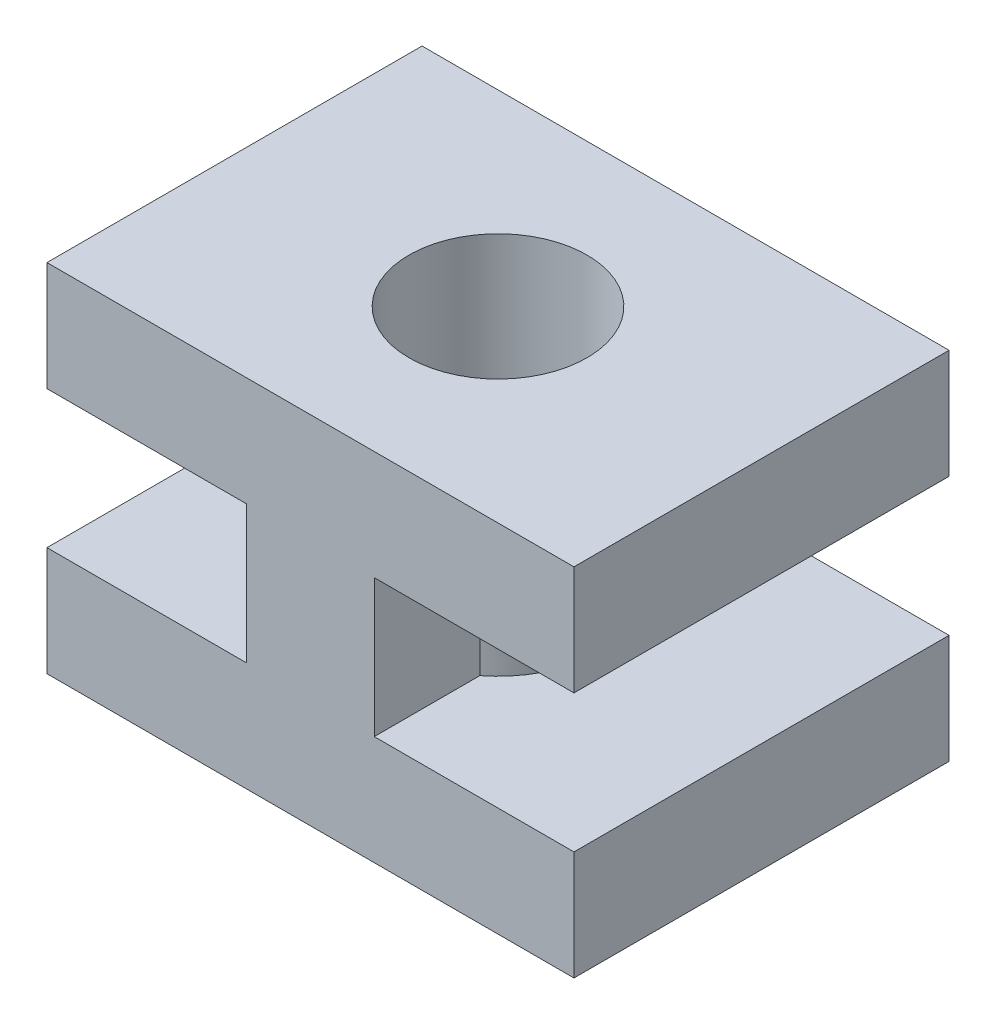
ISO-10303-21;
HEADER;
FILE_DESCRIPTION(('STEP AP214'),'2;1');
FILE_NAME('part.step','',(''),(''),'','','');
FILE_SCHEMA(('AUTOMOTIVE_DESIGN { 1 0 10303 214 1 1 1 1 }'));
ENDSEC;
DATA;
#1=APPLICATION_CONTEXT('core data for automotive mechanical design processes');
#2=APPLICATION_PROTOCOL_DEFINITION('international standard','automotive_design',2000,#1);
#3=PRODUCT_CONTEXT('',#1,'mechanical');
#4=PRODUCT('Part','Part','',(#3));
#5=PRODUCT_RELATED_PRODUCT_CATEGORY('part','',(#4));
#6=PRODUCT_DEFINITION_FORMATION('','',#4);
#7=PRODUCT_DEFINITION_CONTEXT('part definition',#1,'design');
#8=PRODUCT_DEFINITION('design','',#6,#7);
#9=PRODUCT_DEFINITION_SHAPE('','',#8);
#10=(LENGTH_UNIT() NAMED_UNIT(*) SI_UNIT(.MILLI.,.METRE.));
#11=(NAMED_UNIT(*) PLANE_ANGLE_UNIT() SI_UNIT($,.RADIAN.));
#12=(NAMED_UNIT(*) SI_UNIT($,.STERADIAN.) SOLID_ANGLE_UNIT());
#13=UNCERTAINTY_MEASURE_WITH_UNIT(LENGTH_MEASURE(1.E-05),#10,'distance_accuracy_value','');
#14=(GEOMETRIC_REPRESENTATION_CONTEXT(3) GLOBAL_UNCERTAINTY_ASSIGNED_CONTEXT((#13)) GLOBAL_UNIT_ASSIGNED_CONTEXT((#10,
#11,#12)) REPRESENTATION_CONTEXT('',''));
#15=CARTESIAN_POINT('',(0.,0.,0.));
#16=DIRECTION('',(0.,0.,1.));
#17=DIRECTION('',(1.,0.,0.));
#18=AXIS2_PLACEMENT_3D('',#15,#16,#17);
#19=CARTESIAN_POINT('',(1.075,1.16,0.));
#20=DIRECTION('',(-1.,0.,0.));
#21=DIRECTION('',(0.,0.,1.));
#22=AXIS2_PLACEMENT_3D('',#19,#20,#21);
#23=PLANE('',#22);
#24=DIRECTION('',(0.,-1.,0.));
#25=VECTOR('',#24,1.);
#26=CARTESIAN_POINT('',(1.075,1.16,3.16));
#27=LINE('',#26,#25);
#28=CARTESIAN_POINT('',(1.075,1.16,3.16));
#29=VERTEX_POINT('',#28);
#30=CARTESIAN_POINT('',(1.075,-1.16,3.16));
#31=VERTEX_POINT('',#30);
#32=EDGE_CURVE('E48',#29,#31,#27,.T.);
#33=ORIENTED_EDGE('',*,*,#32,.T.);
#34=DIRECTION('',(0.,0.,-1.));
#35=VECTOR('',#34,1.);
#36=CARTESIAN_POINT('',(1.075,-1.16,0.));
#37=LINE('',#36,#35);
#38=CARTESIAN_POINT('',(1.075,-1.16,1.38089644796415));
#39=VERTEX_POINT('',#38);
#40=EDGE_CURVE('E134',#31,#39,#37,.T.);
#41=ORIENTED_EDGE('',*,*,#40,.T.);
#42=DIRECTION('',(0.,-1.,0.));
#43=VECTOR('',#42,1.);
#44=CARTESIAN_POINT('',(1.075,1.16,1.38089644796415));
#45=LINE('',#44,#43);
#46=CARTESIAN_POINT('',(1.075,1.16,1.38089644796415));
#47=VERTEX_POINT('',#46);
#48=EDGE_CURVE('E11',#47,#39,#45,.T.);
#49=ORIENTED_EDGE('',*,*,#48,.F.);
#50=DIRECTION('',(0.,0.,-1.));
#51=VECTOR('',#50,1.);
#52=CARTESIAN_POINT('',(1.075,1.16,0.));
#53=LINE('',#52,#51);
#54=EDGE_CURVE('E211',#29,#47,#53,.T.);
#55=ORIENTED_EDGE('',*,*,#54,.F.);
#56=EDGE_LOOP('',(#33,#41,#49,#55));
#57=FACE_BOUND('',#56,.T.);
#58=ADVANCED_FACE('F34',(#57),#23,.F.);
#59=CARTESIAN_POINT('',(0.,1.16,0.));
#60=DIRECTION('',(0.,-1.,0.));
#61=DIRECTION('',(0.,0.,-1.));
#62=AXIS2_PLACEMENT_3D('',#59,#60,#61);
#63=CYLINDRICAL_SURFACE('',#62,1.75);
#64=ORIENTED_EDGE('',*,*,#48,.T.);
#65=CARTESIAN_POINT('',(0.,-1.16,0.));
#66=DIRECTION('',(0.,1.,0.));
#67=DIRECTION('',(0.,0.,1.));
#68=AXIS2_PLACEMENT_3D('',#65,#66,#67);
#69=CIRCLE('',#68,1.75);
#70=CARTESIAN_POINT('',(-1.075,-1.16,1.38089644796415));
#71=VERTEX_POINT('',#70);
#72=EDGE_CURVE('E174',#39,#71,#69,.T.);
#73=ORIENTED_EDGE('',*,*,#72,.T.);
#74=DIRECTION('',(0.,-1.,0.));
#75=VECTOR('',#74,1.);
#76=CARTESIAN_POINT('',(-1.075,1.16,1.38089644796415));
#77=LINE('',#76,#75);
#78=CARTESIAN_POINT('',(-1.075,1.16,1.38089644796415));
#79=VERTEX_POINT('',#78);
#80=EDGE_CURVE('E41',#79,#71,#77,.T.);
#81=ORIENTED_EDGE('',*,*,#80,.F.);
#82=CARTESIAN_POINT('',(0.,1.16,0.));
#83=DIRECTION('',(0.,1.,0.));
#84=DIRECTION('',(0.,0.,1.));
#85=AXIS2_PLACEMENT_3D('',#82,#83,#84);
#86=CIRCLE('',#85,1.75);
#87=EDGE_CURVE('E214',#47,#79,#86,.T.);
#88=ORIENTED_EDGE('',*,*,#87,.F.);
#89=EDGE_LOOP('',(#64,#73,#81,#88));
#90=FACE_BOUND('',#89,.T.);
#91=ADVANCED_FACE('F225',(#90),#63,.T.);
#92=CARTESIAN_POINT('',(-1.075,1.16,0.));
#93=DIRECTION('',(1.,0.,0.));
#94=DIRECTION('',(0.,0.,-1.));
#95=AXIS2_PLACEMENT_3D('',#92,#93,#94);
#96=PLANE('',#95);
#97=ORIENTED_EDGE('',*,*,#80,.T.);
#98=DIRECTION('',(0.,0.,1.));
#99=VECTOR('',#98,1.);
#100=CARTESIAN_POINT('',(-1.075,-1.16,0.));
#101=LINE('',#100,#99);
#102=CARTESIAN_POINT('',(-1.075,-1.16,3.16));
#103=VERTEX_POINT('',#102);
#104=EDGE_CURVE('E171',#71,#103,#101,.T.);
#105=ORIENTED_EDGE('',*,*,#104,.T.);
#106=DIRECTION('',(0.,-1.,0.));
#107=VECTOR('',#106,1.);
#108=CARTESIAN_POINT('',(-1.075,1.16,3.16));
#109=LINE('',#108,#107);
#110=CARTESIAN_POINT('',(-1.075,1.16,3.16));
#111=VERTEX_POINT('',#110);
#112=EDGE_CURVE('E221',#111,#103,#109,.T.);
#113=ORIENTED_EDGE('',*,*,#112,.F.);
#114=DIRECTION('',(0.,0.,1.));
#115=VECTOR('',#114,1.);
#116=CARTESIAN_POINT('',(-1.075,1.16,0.));
#117=LINE('',#116,#115);
#118=EDGE_CURVE('E217',#79,#111,#117,.T.);
#119=ORIENTED_EDGE('',*,*,#118,.F.);
#120=EDGE_LOOP('',(#97,#105,#113,#119));
#121=FACE_BOUND('',#120,.T.);
#122=ADVANCED_FACE('F224',(#121),#96,.F.);
#123=CARTESIAN_POINT('',(0.,1.16,3.16));
#124=DIRECTION('',(0.,0.,-1.));
#125=DIRECTION('',(-1.,0.,0.));
#126=AXIS2_PLACEMENT_3D('',#123,#124,#125);
#127=PLANE('',#126);
#128=ORIENTED_EDGE('',*,*,#112,.T.);
#129=DIRECTION('',(1.,0.,0.));
#130=VECTOR('',#129,1.);
#131=CARTESIAN_POINT('',(-4.44,-1.16,3.16));
#132=LINE('',#131,#130);
#133=CARTESIAN_POINT('',(-4.44,-1.16,3.16));
#134=VERTEX_POINT('',#133);
#135=EDGE_CURVE('E145',#134,#103,#132,.T.);
#136=ORIENTED_EDGE('',*,*,#135,.F.);
#137=DIRECTION('',(0.,1.,0.));
#138=VECTOR('',#137,1.);
#139=CARTESIAN_POINT('',(-4.44,-3.,3.16));
#140=LINE('',#139,#138);
#141=CARTESIAN_POINT('',(-4.44,-3.,3.16));
#142=VERTEX_POINT('',#141);
#143=EDGE_CURVE('E154',#142,#134,#140,.T.);
#144=ORIENTED_EDGE('',*,*,#143,.F.);
#145=DIRECTION('',(1.,0.,0.));
#146=VECTOR('',#145,1.);
#147=CARTESIAN_POINT('',(-4.44,-3.,3.16));
#148=LINE('',#147,#146);
#149=CARTESIAN_POINT('',(4.44,-3.,3.16));
#150=VERTEX_POINT('',#149);
#151=EDGE_CURVE('E144',#142,#150,#148,.T.);
#152=ORIENTED_EDGE('',*,*,#151,.T.);
#153=DIRECTION('',(0.,1.,0.));
#154=VECTOR('',#153,1.);
#155=CARTESIAN_POINT('',(4.44,-3.,3.16));
#156=LINE('',#155,#154);
#157=CARTESIAN_POINT('',(4.44,-1.16,3.16));
#158=VERTEX_POINT('',#157);
#159=EDGE_CURVE('E165',#150,#158,#156,.T.);
#160=ORIENTED_EDGE('',*,*,#159,.T.);
#161=EDGE_CURVE('E162',#31,#158,#132,.T.);
#162=ORIENTED_EDGE('',*,*,#161,.F.);
#163=ORIENTED_EDGE('',*,*,#32,.F.);
#164=DIRECTION('',(1.,0.,0.));
#165=VECTOR('',#164,1.);
#166=CARTESIAN_POINT('',(-4.44,1.16,3.16));
#167=LINE('',#166,#165);
#168=CARTESIAN_POINT('',(4.44,1.16,3.16));
#169=VERTEX_POINT('',#168);
#170=EDGE_CURVE('E193',#29,#169,#167,.T.);
#171=ORIENTED_EDGE('',*,*,#170,.T.);
#172=DIRECTION('',(0.,-1.,0.));
#173=VECTOR('',#172,1.);
#174=CARTESIAN_POINT('',(4.44,3.,3.16));
#175=LINE('',#174,#173);
#176=CARTESIAN_POINT('',(4.44,3.,3.16));
#177=VERTEX_POINT('',#176);
#178=EDGE_CURVE('E205',#177,#169,#175,.T.);
#179=ORIENTED_EDGE('',*,*,#178,.F.);
#180=DIRECTION('',(1.,0.,0.));
#181=VECTOR('',#180,1.);
#182=CARTESIAN_POINT('',(-4.44,3.,3.16));
#183=LINE('',#182,#181);
#184=CARTESIAN_POINT('',(-4.44,3.,3.16));
#185=VERTEX_POINT('',#184);
#186=EDGE_CURVE('E183',#185,#177,#183,.T.);
#187=ORIENTED_EDGE('',*,*,#186,.F.);
#188=DIRECTION('',(0.,-1.,0.));
#189=VECTOR('',#188,1.);
#190=CARTESIAN_POINT('',(-4.44,3.,3.16));
#191=LINE('',#190,#189);
#192=CARTESIAN_POINT('',(-4.44,1.16,3.16));
#193=VERTEX_POINT('',#192);
#194=EDGE_CURVE('E208',#185,#193,#191,.T.);
#195=ORIENTED_EDGE('',*,*,#194,.T.);
#196=EDGE_CURVE('E194',#193,#111,#167,.T.);
#197=ORIENTED_EDGE('',*,*,#196,.T.);
#198=EDGE_LOOP('',(#128,#136,#144,#152,#160,#162,#163,#171,#179,#187,#195,#197));
#199=FACE_BOUND('',#198,.T.);
#200=ADVANCED_FACE('F230',(#199),#127,.F.);
#201=CARTESIAN_POINT('',(0.,1.16,0.));
#202=DIRECTION('',(0.,-1.,0.));
#203=DIRECTION('',(0.,0.,-1.));
#204=AXIS2_PLACEMENT_3D('',#201,#202,#203);
#205=CYLINDRICAL_SURFACE('',#204,1.5);
#206=CARTESIAN_POINT('',(0.,3.,0.));
#207=DIRECTION('',(0.,1.,0.));
#208=DIRECTION('',(0.,0.,1.));
#209=AXIS2_PLACEMENT_3D('',#206,#207,#208);
#210=CIRCLE('',#209,1.5);
#211=CARTESIAN_POINT('',(0.,3.,1.5));
#212=VERTEX_POINT('',#211);
#213=EDGE_CURVE('E176',#212,#212,#210,.T.);
#214=ORIENTED_EDGE('',*,*,#213,.T.);
#215=EDGE_LOOP('',(#214));
#216=FACE_BOUND('',#215,.T.);
#217=CARTESIAN_POINT('',(0.,-3.,0.));
#218=DIRECTION('',(0.,1.,0.));
#219=DIRECTION('',(0.,0.,1.));
#220=AXIS2_PLACEMENT_3D('',#217,#218,#219);
#221=CIRCLE('',#220,1.5);
#222=CARTESIAN_POINT('',(0.,-3.,1.5));
#223=VERTEX_POINT('',#222);
#224=EDGE_CURVE('E157',#223,#223,#221,.T.);
#225=ORIENTED_EDGE('',*,*,#224,.F.);
#226=EDGE_LOOP('',(#225));
#227=FACE_BOUND('',#226,.T.);
#228=ADVANCED_FACE('F274',(#216,#227),#205,.F.);
#229=CARTESIAN_POINT('',(0.,1.16,0.));
#230=DIRECTION('',(0.,1.,0.));
#231=DIRECTION('',(0.,0.,1.));
#232=AXIS2_PLACEMENT_3D('',#229,#230,#231);
#233=PLANE('',#232);
#234=ORIENTED_EDGE('',*,*,#170,.F.);
#235=ORIENTED_EDGE('',*,*,#54,.T.);
#236=ORIENTED_EDGE('',*,*,#87,.T.);
#237=ORIENTED_EDGE('',*,*,#118,.T.);
#238=ORIENTED_EDGE('',*,*,#196,.F.);
#239=DIRECTION('',(0.,0.,1.));
#240=VECTOR('',#239,1.);
#241=CARTESIAN_POINT('',(-4.44,1.16,-3.16));
#242=LINE('',#241,#240);
#243=CARTESIAN_POINT('',(-4.44,1.16,-3.16));
#244=VERTEX_POINT('',#243);
#245=EDGE_CURVE('E179',#244,#193,#242,.T.);
#246=ORIENTED_EDGE('',*,*,#245,.F.);
#247=DIRECTION('',(-1.,0.,0.));
#248=VECTOR('',#247,1.);
#249=CARTESIAN_POINT('',(-4.44,1.16,-3.16));
#250=LINE('',#249,#248);
#251=CARTESIAN_POINT('',(4.44,1.16,-3.16));
#252=VERTEX_POINT('',#251);
#253=EDGE_CURVE('E184',#252,#244,#250,.T.);
#254=ORIENTED_EDGE('',*,*,#253,.F.);
#255=DIRECTION('',(0.,0.,-1.));
#256=VECTOR('',#255,1.);
#257=CARTESIAN_POINT('',(4.44,1.16,-3.16));
#258=LINE('',#257,#256);
#259=EDGE_CURVE('E197',#169,#252,#258,.T.);
#260=ORIENTED_EDGE('',*,*,#259,.F.);
#261=EDGE_LOOP('',(#234,#235,#236,#237,#238,#246,#254,#260));
#262=FACE_BOUND('',#261,.T.);
#263=ADVANCED_FACE('F233',(#262),#233,.F.);
#264=CARTESIAN_POINT('',(0.,3.,0.));
#265=DIRECTION('',(0.,1.,0.));
#266=DIRECTION('',(0.,0.,1.));
#267=AXIS2_PLACEMENT_3D('',#264,#265,#266);
#268=PLANE('',#267);
#269=DIRECTION('',(0.,0.,1.));
#270=VECTOR('',#269,1.);
#271=CARTESIAN_POINT('',(-4.44,3.,-3.16));
#272=LINE('',#271,#270);
#273=CARTESIAN_POINT('',(-4.44,3.,-3.16));
#274=VERTEX_POINT('',#273);
#275=EDGE_CURVE('E180',#274,#185,#272,.T.);
#276=ORIENTED_EDGE('',*,*,#275,.T.);
#277=ORIENTED_EDGE('',*,*,#186,.T.);
#278=DIRECTION('',(0.,0.,-1.));
#279=VECTOR('',#278,1.);
#280=CARTESIAN_POINT('',(4.44,3.,-3.16));
#281=LINE('',#280,#279);
#282=CARTESIAN_POINT('',(4.44,3.,-3.16));
#283=VERTEX_POINT('',#282);
#284=EDGE_CURVE('E186',#177,#283,#281,.T.);
#285=ORIENTED_EDGE('',*,*,#284,.T.);
#286=DIRECTION('',(-1.,0.,0.));
#287=VECTOR('',#286,1.);
#288=CARTESIAN_POINT('',(-4.44,3.,-3.16));
#289=LINE('',#288,#287);
#290=EDGE_CURVE('E188',#283,#274,#289,.T.);
#291=ORIENTED_EDGE('',*,*,#290,.T.);
#292=EDGE_LOOP('',(#276,#277,#285,#291));
#293=FACE_BOUND('',#292,.T.);
#294=ORIENTED_EDGE('',*,*,#213,.F.);
#295=EDGE_LOOP('',(#294));
#296=FACE_BOUND('',#295,.T.);
#297=ADVANCED_FACE('F245',(#293,#296),#268,.T.);
#298=CARTESIAN_POINT('',(-4.44,3.,-3.16));
#299=DIRECTION('',(1.,0.,0.));
#300=DIRECTION('',(0.,0.,-1.));
#301=AXIS2_PLACEMENT_3D('',#298,#299,#300);
#302=PLANE('',#301);
#303=ORIENTED_EDGE('',*,*,#245,.T.);
#304=ORIENTED_EDGE('',*,*,#194,.F.);
#305=ORIENTED_EDGE('',*,*,#275,.F.);
#306=DIRECTION('',(0.,-1.,0.));
#307=VECTOR('',#306,1.);
#308=CARTESIAN_POINT('',(-4.44,3.,-3.16));
#309=LINE('',#308,#307);
#310=EDGE_CURVE('E190',#274,#244,#309,.T.);
#311=ORIENTED_EDGE('',*,*,#310,.T.);
#312=EDGE_LOOP('',(#303,#304,#305,#311));
#313=FACE_BOUND('',#312,.T.);
#314=ADVANCED_FACE('F251',(#313),#302,.F.);
#315=CARTESIAN_POINT('',(4.44,3.,-3.16));
#316=DIRECTION('',(-1.,0.,0.));
#317=DIRECTION('',(0.,0.,1.));
#318=AXIS2_PLACEMENT_3D('',#315,#316,#317);
#319=PLANE('',#318);
#320=ORIENTED_EDGE('',*,*,#259,.T.);
#321=DIRECTION('',(0.,-1.,0.));
#322=VECTOR('',#321,1.);
#323=CARTESIAN_POINT('',(4.44,3.,-3.16));
#324=LINE('',#323,#322);
#325=EDGE_CURVE('E202',#283,#252,#324,.T.);
#326=ORIENTED_EDGE('',*,*,#325,.F.);
#327=ORIENTED_EDGE('',*,*,#284,.F.);
#328=ORIENTED_EDGE('',*,*,#178,.T.);
#329=EDGE_LOOP('',(#320,#326,#327,#328));
#330=FACE_BOUND('',#329,.T.);
#331=ADVANCED_FACE('F241',(#330),#319,.F.);
#332=CARTESIAN_POINT('',(-4.44,3.,-3.16));
#333=DIRECTION('',(0.,0.,1.));
#334=DIRECTION('',(1.,0.,0.));
#335=AXIS2_PLACEMENT_3D('',#332,#333,#334);
#336=PLANE('',#335);
#337=ORIENTED_EDGE('',*,*,#253,.T.);
#338=ORIENTED_EDGE('',*,*,#310,.F.);
#339=ORIENTED_EDGE('',*,*,#290,.F.);
#340=ORIENTED_EDGE('',*,*,#325,.T.);
#341=EDGE_LOOP('',(#337,#338,#339,#340));
#342=FACE_BOUND('',#341,.T.);
#343=ADVANCED_FACE('F253',(#342),#336,.F.);
#344=CARTESIAN_POINT('',(-4.44,-3.,-3.16));
#345=DIRECTION('',(-1.,0.,0.));
#346=DIRECTION('',(0.,0.,1.));
#347=AXIS2_PLACEMENT_3D('',#344,#345,#346);
#348=PLANE('',#347);
#349=DIRECTION('',(0.,0.,1.));
#350=VECTOR('',#349,1.);
#351=CARTESIAN_POINT('',(-4.44,-1.16,-3.16));
#352=LINE('',#351,#350);
#353=CARTESIAN_POINT('',(-4.44,-1.16,-3.16));
#354=VERTEX_POINT('',#353);
#355=EDGE_CURVE('E129',#354,#134,#352,.T.);
#356=ORIENTED_EDGE('',*,*,#355,.F.);
#357=DIRECTION('',(0.,1.,0.));
#358=VECTOR('',#357,1.);
#359=CARTESIAN_POINT('',(-4.44,-3.,-3.16));
#360=LINE('',#359,#358);
#361=CARTESIAN_POINT('',(-4.44,-3.,-3.16));
#362=VERTEX_POINT('',#361);
#363=EDGE_CURVE('E123',#362,#354,#360,.T.);
#364=ORIENTED_EDGE('',*,*,#363,.F.);
#365=DIRECTION('',(0.,0.,1.));
#366=VECTOR('',#365,1.);
#367=CARTESIAN_POINT('',(-4.44,-3.,-3.16));
#368=LINE('',#367,#366);
#369=EDGE_CURVE('E126',#362,#142,#368,.T.);
#370=ORIENTED_EDGE('',*,*,#369,.T.);
#371=ORIENTED_EDGE('',*,*,#143,.T.);
#372=EDGE_LOOP('',(#356,#364,#370,#371));
#373=FACE_BOUND('',#372,.T.);
#374=ADVANCED_FACE('F125',(#373),#348,.T.);
#375=CARTESIAN_POINT('',(-4.44,-3.,-3.16));
#376=DIRECTION('',(0.,0.,-1.));
#377=DIRECTION('',(-1.,0.,0.));
#378=AXIS2_PLACEMENT_3D('',#375,#376,#377);
#379=PLANE('',#378);
#380=DIRECTION('',(-1.,0.,0.));
#381=VECTOR('',#380,1.);
#382=CARTESIAN_POINT('',(-4.44,-1.16,-3.16));
#383=LINE('',#382,#381);
#384=CARTESIAN_POINT('',(4.44,-1.16,-3.16));
#385=VERTEX_POINT('',#384);
#386=EDGE_CURVE('E156',#385,#354,#383,.T.);
#387=ORIENTED_EDGE('',*,*,#386,.F.);
#388=DIRECTION('',(0.,1.,0.));
#389=VECTOR('',#388,1.);
#390=CARTESIAN_POINT('',(4.44,-3.,-3.16));
#391=LINE('',#390,#389);
#392=CARTESIAN_POINT('',(4.44,-3.,-3.16));
#393=VERTEX_POINT('',#392);
#394=EDGE_CURVE('E135',#393,#385,#391,.T.);
#395=ORIENTED_EDGE('',*,*,#394,.F.);
#396=DIRECTION('',(-1.,0.,0.));
#397=VECTOR('',#396,1.);
#398=CARTESIAN_POINT('',(-4.44,-3.,-3.16));
#399=LINE('',#398,#397);
#400=EDGE_CURVE('E141',#393,#362,#399,.T.);
#401=ORIENTED_EDGE('',*,*,#400,.T.);
#402=ORIENTED_EDGE('',*,*,#363,.T.);
#403=EDGE_LOOP('',(#387,#395,#401,#402));
#404=FACE_BOUND('',#403,.T.);
#405=ADVANCED_FACE('F147',(#404),#379,.T.);
#406=CARTESIAN_POINT('',(4.44,-3.,-3.16));
#407=DIRECTION('',(1.,0.,0.));
#408=DIRECTION('',(0.,0.,-1.));
#409=AXIS2_PLACEMENT_3D('',#406,#407,#408);
#410=PLANE('',#409);
#411=DIRECTION('',(0.,0.,-1.));
#412=VECTOR('',#411,1.);
#413=CARTESIAN_POINT('',(4.44,-1.16,-3.16));
#414=LINE('',#413,#412);
#415=EDGE_CURVE('E159',#158,#385,#414,.T.);
#416=ORIENTED_EDGE('',*,*,#415,.F.);
#417=ORIENTED_EDGE('',*,*,#159,.F.);
#418=DIRECTION('',(0.,0.,-1.));
#419=VECTOR('',#418,1.);
#420=CARTESIAN_POINT('',(4.44,-3.,-3.16));
#421=LINE('',#420,#419);
#422=EDGE_CURVE('E148',#150,#393,#421,.T.);
#423=ORIENTED_EDGE('',*,*,#422,.T.);
#424=ORIENTED_EDGE('',*,*,#394,.T.);
#425=EDGE_LOOP('',(#416,#417,#423,#424));
#426=FACE_BOUND('',#425,.T.);
#427=ADVANCED_FACE('F289',(#426),#410,.T.);
#428=CARTESIAN_POINT('',(0.,-3.,0.));
#429=DIRECTION('',(0.,-1.,0.));
#430=DIRECTION('',(0.,0.,1.));
#431=AXIS2_PLACEMENT_3D('',#428,#429,#430);
#432=PLANE('',#431);
#433=ORIENTED_EDGE('',*,*,#224,.T.);
#434=EDGE_LOOP('',(#433));
#435=FACE_BOUND('',#434,.T.);
#436=ORIENTED_EDGE('',*,*,#369,.F.);
#437=ORIENTED_EDGE('',*,*,#400,.F.);
#438=ORIENTED_EDGE('',*,*,#422,.F.);
#439=ORIENTED_EDGE('',*,*,#151,.F.);
#440=EDGE_LOOP('',(#436,#437,#438,#439));
#441=FACE_BOUND('',#440,.T.);
#442=ADVANCED_FACE('F139',(#435,#441),#432,.T.);
#443=CARTESIAN_POINT('',(0.,-1.16,0.));
#444=DIRECTION('',(0.,-1.,0.));
#445=DIRECTION('',(0.,0.,1.));
#446=AXIS2_PLACEMENT_3D('',#443,#444,#445);
#447=PLANE('',#446);
#448=ORIENTED_EDGE('',*,*,#40,.F.);
#449=ORIENTED_EDGE('',*,*,#161,.T.);
#450=ORIENTED_EDGE('',*,*,#415,.T.);
#451=ORIENTED_EDGE('',*,*,#386,.T.);
#452=ORIENTED_EDGE('',*,*,#355,.T.);
#453=ORIENTED_EDGE('',*,*,#135,.T.);
#454=ORIENTED_EDGE('',*,*,#104,.F.);
#455=ORIENTED_EDGE('',*,*,#72,.F.);
#456=EDGE_LOOP('',(#448,#449,#450,#451,#452,#453,#454,#455));
#457=FACE_BOUND('',#456,.T.);
#458=ADVANCED_FACE('F228',(#457),#447,.F.);
#459=CLOSED_SHELL('',(#58,#91,#122,#200,#228,#263,#297,#314,#331,#343,#374,#405,#427,#442,#458));
#460=MANIFOLD_SOLID_BREP('B2',#459);
#461=ADVANCED_BREP_SHAPE_REPRESENTATION('',(#18,#460),#14);
#462=SHAPE_DEFINITION_REPRESENTATION(#9,#461);
ENDSEC;
END-ISO-10303-21;
